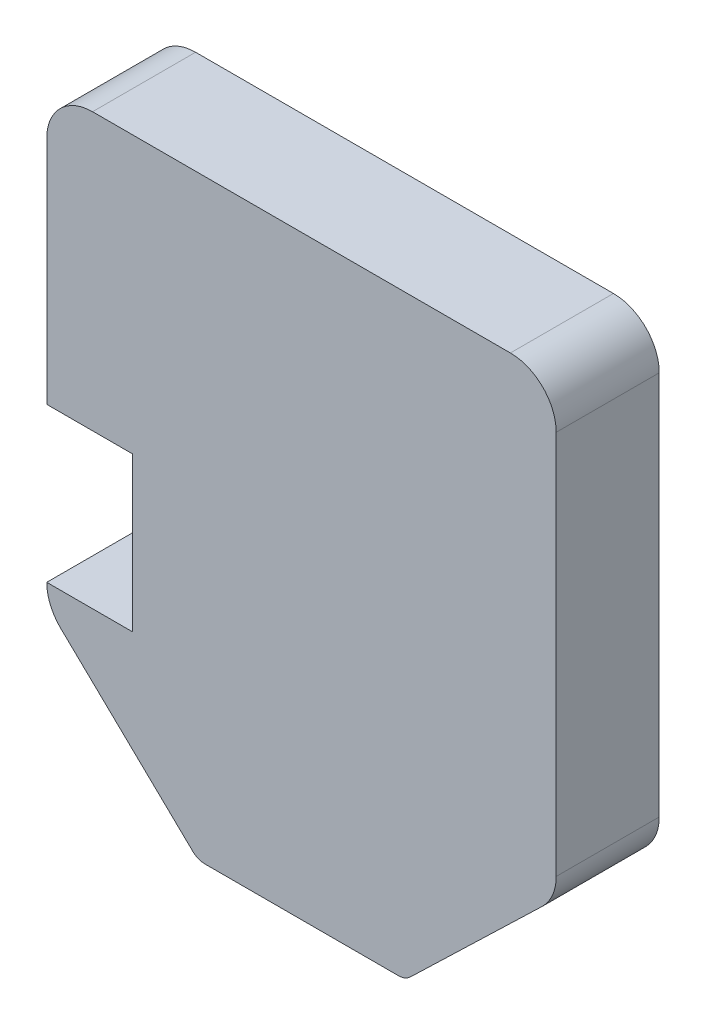
ISO-10303-21;
HEADER;
FILE_DESCRIPTION(('STEP AP214'),'2;1');
FILE_NAME('part.step','',(''),(''),'','','');
FILE_SCHEMA(('AUTOMOTIVE_DESIGN { 1 0 10303 214 1 1 1 1 }'));
ENDSEC;
DATA;
#1=APPLICATION_CONTEXT('core data for automotive mechanical design processes');
#2=APPLICATION_PROTOCOL_DEFINITION('international standard','automotive_design',2000,#1);
#3=PRODUCT_CONTEXT('',#1,'mechanical');
#4=PRODUCT('Part','Part','',(#3));
#5=PRODUCT_RELATED_PRODUCT_CATEGORY('part','',(#4));
#6=PRODUCT_DEFINITION_FORMATION('','',#4);
#7=PRODUCT_DEFINITION_CONTEXT('part definition',#1,'design');
#8=PRODUCT_DEFINITION('design','',#6,#7);
#9=PRODUCT_DEFINITION_SHAPE('','',#8);
#10=(LENGTH_UNIT() NAMED_UNIT(*) SI_UNIT(.MILLI.,.METRE.));
#11=(NAMED_UNIT(*) PLANE_ANGLE_UNIT() SI_UNIT($,.RADIAN.));
#12=(NAMED_UNIT(*) SI_UNIT($,.STERADIAN.) SOLID_ANGLE_UNIT());
#13=UNCERTAINTY_MEASURE_WITH_UNIT(LENGTH_MEASURE(1.E-05),#10,'distance_accuracy_value','');
#14=(GEOMETRIC_REPRESENTATION_CONTEXT(3) GLOBAL_UNCERTAINTY_ASSIGNED_CONTEXT((#13)) GLOBAL_UNIT_ASSIGNED_CONTEXT((#10,
#11,#12)) REPRESENTATION_CONTEXT('',''));
#15=CARTESIAN_POINT('',(0.,0.,0.));
#16=DIRECTION('',(0.,0.,1.));
#17=DIRECTION('',(1.,0.,0.));
#18=AXIS2_PLACEMENT_3D('',#15,#16,#17);
#19=CARTESIAN_POINT('',(36.5,70.602575789524,9.));
#20=DIRECTION('',(0.,0.,-1.));
#21=DIRECTION('',(-1.,0.,0.));
#22=AXIS2_PLACEMENT_3D('',#19,#20,#21);
#23=CYLINDRICAL_SURFACE('',#22,8.);
#24=CARTESIAN_POINT('',(36.5,70.602575789524,-9.));
#25=DIRECTION('',(0.,0.,-1.));
#26=DIRECTION('',(-1.,0.,0.));
#27=AXIS2_PLACEMENT_3D('',#24,#25,#26);
#28=CIRCLE('',#27,8.);
#29=CARTESIAN_POINT('',(36.5,78.602575789524,-9.));
#30=VERTEX_POINT('',#29);
#31=CARTESIAN_POINT('',(44.5,70.602575789524,-9.));
#32=VERTEX_POINT('',#31);
#33=EDGE_CURVE('E175',#30,#32,#28,.T.);
#34=ORIENTED_EDGE('',*,*,#33,.F.);
#35=DIRECTION('',(0.,0.,-1.));
#36=VECTOR('',#35,1.);
#37=CARTESIAN_POINT('',(36.5,78.602575789524,9.));
#38=LINE('',#37,#36);
#39=CARTESIAN_POINT('',(36.5,78.602575789524,9.));
#40=VERTEX_POINT('',#39);
#41=EDGE_CURVE('E11',#40,#30,#38,.T.);
#42=ORIENTED_EDGE('',*,*,#41,.F.);
#43=CARTESIAN_POINT('',(36.5,70.602575789524,9.));
#44=DIRECTION('',(0.,0.,-1.));
#45=DIRECTION('',(-1.,0.,0.));
#46=AXIS2_PLACEMENT_3D('',#43,#44,#45);
#47=CIRCLE('',#46,8.);
#48=CARTESIAN_POINT('',(44.5,70.602575789524,9.));
#49=VERTEX_POINT('',#48);
#50=EDGE_CURVE('E202',#40,#49,#47,.T.);
#51=ORIENTED_EDGE('',*,*,#50,.T.);
#52=DIRECTION('',(0.,0.,-1.));
#53=VECTOR('',#52,1.);
#54=CARTESIAN_POINT('',(44.5,70.602575789524,9.));
#55=LINE('',#54,#53);
#56=EDGE_CURVE('E43',#49,#32,#55,.T.);
#57=ORIENTED_EDGE('',*,*,#56,.T.);
#58=EDGE_LOOP('',(#34,#42,#51,#57));
#59=FACE_BOUND('',#58,.T.);
#60=ADVANCED_FACE('F37',(#59),#23,.T.);
#61=CARTESIAN_POINT('',(-36.5,78.602575789524,9.));
#62=DIRECTION('',(0.,1.,0.));
#63=DIRECTION('',(0.,0.,1.));
#64=AXIS2_PLACEMENT_3D('',#61,#62,#63);
#65=PLANE('',#64);
#66=DIRECTION('',(1.,0.,0.));
#67=VECTOR('',#66,1.);
#68=CARTESIAN_POINT('',(-36.5,78.602575789524,-9.));
#69=LINE('',#68,#67);
#70=CARTESIAN_POINT('',(-36.5,78.602575789524,-9.));
#71=VERTEX_POINT('',#70);
#72=EDGE_CURVE('E201',#71,#30,#69,.T.);
#73=ORIENTED_EDGE('',*,*,#72,.F.);
#74=DIRECTION('',(0.,0.,-1.));
#75=VECTOR('',#74,1.);
#76=CARTESIAN_POINT('',(-36.5,78.602575789524,9.));
#77=LINE('',#76,#75);
#78=CARTESIAN_POINT('',(-36.5,78.602575789524,9.));
#79=VERTEX_POINT('',#78);
#80=EDGE_CURVE('E48',#79,#71,#77,.T.);
#81=ORIENTED_EDGE('',*,*,#80,.F.);
#82=DIRECTION('',(1.,0.,0.));
#83=VECTOR('',#82,1.);
#84=CARTESIAN_POINT('',(-36.5,78.602575789524,9.));
#85=LINE('',#84,#83);
#86=EDGE_CURVE('E150',#79,#40,#85,.T.);
#87=ORIENTED_EDGE('',*,*,#86,.T.);
#88=ORIENTED_EDGE('',*,*,#41,.T.);
#89=EDGE_LOOP('',(#73,#81,#87,#88));
#90=FACE_BOUND('',#89,.T.);
#91=ADVANCED_FACE('F223',(#90),#65,.T.);
#92=CARTESIAN_POINT('',(-36.5,70.602575789524,9.));
#93=DIRECTION('',(0.,0.,-1.));
#94=DIRECTION('',(-1.,0.,0.));
#95=AXIS2_PLACEMENT_3D('',#92,#93,#94);
#96=CYLINDRICAL_SURFACE('',#95,8.);
#97=CARTESIAN_POINT('',(-36.5,70.602575789524,-9.));
#98=DIRECTION('',(0.,0.,1.));
#99=DIRECTION('',(1.,0.,0.));
#100=AXIS2_PLACEMENT_3D('',#97,#98,#99);
#101=CIRCLE('',#100,8.);
#102=CARTESIAN_POINT('',(-44.5,70.602575789524,-9.));
#103=VERTEX_POINT('',#102);
#104=EDGE_CURVE('E152',#71,#103,#101,.T.);
#105=ORIENTED_EDGE('',*,*,#104,.T.);
#106=DIRECTION('',(0.,0.,-1.));
#107=VECTOR('',#106,1.);
#108=CARTESIAN_POINT('',(-44.5,70.602575789524,9.));
#109=LINE('',#108,#107);
#110=CARTESIAN_POINT('',(-44.5,70.602575789524,9.));
#111=VERTEX_POINT('',#110);
#112=EDGE_CURVE('E151',#111,#103,#109,.T.);
#113=ORIENTED_EDGE('',*,*,#112,.F.);
#114=CARTESIAN_POINT('',(-36.5,70.602575789524,9.));
#115=DIRECTION('',(0.,0.,1.));
#116=DIRECTION('',(1.,0.,0.));
#117=AXIS2_PLACEMENT_3D('',#114,#115,#116);
#118=CIRCLE('',#117,8.);
#119=EDGE_CURVE('E139',#79,#111,#118,.T.);
#120=ORIENTED_EDGE('',*,*,#119,.F.);
#121=ORIENTED_EDGE('',*,*,#80,.T.);
#122=EDGE_LOOP('',(#105,#113,#120,#121));
#123=FACE_BOUND('',#122,.T.);
#124=ADVANCED_FACE('F155',(#123),#96,.T.);
#125=CARTESIAN_POINT('',(-44.5,70.602575789524,9.));
#126=DIRECTION('',(1.,0.,0.));
#127=DIRECTION('',(0.,1.,0.));
#128=AXIS2_PLACEMENT_3D('',#125,#126,#127);
#129=PLANE('',#128);
#130=DIRECTION('',(0.,-1.,0.));
#131=VECTOR('',#130,1.);
#132=CARTESIAN_POINT('',(-44.5,70.602575789524,-9.));
#133=LINE('',#132,#131);
#134=CARTESIAN_POINT('',(-44.5,30.323453466929,-9.));
#135=VERTEX_POINT('',#134);
#136=EDGE_CURVE('E199',#103,#135,#133,.T.);
#137=ORIENTED_EDGE('',*,*,#136,.T.);
#138=DIRECTION('',(0.,0.,-1.));
#139=VECTOR('',#138,1.);
#140=CARTESIAN_POINT('',(-44.5,30.323453466929,9.));
#141=LINE('',#140,#139);
#142=CARTESIAN_POINT('',(-44.5,30.323453466929,9.));
#143=VERTEX_POINT('',#142);
#144=EDGE_CURVE('E162',#143,#135,#141,.T.);
#145=ORIENTED_EDGE('',*,*,#144,.F.);
#146=DIRECTION('',(0.,-1.,0.));
#147=VECTOR('',#146,1.);
#148=CARTESIAN_POINT('',(-44.5,70.602575789524,9.));
#149=LINE('',#148,#147);
#150=EDGE_CURVE('E148',#111,#143,#149,.T.);
#151=ORIENTED_EDGE('',*,*,#150,.F.);
#152=ORIENTED_EDGE('',*,*,#112,.T.);
#153=EDGE_LOOP('',(#137,#145,#151,#152));
#154=FACE_BOUND('',#153,.T.);
#155=ADVANCED_FACE('F161',(#154),#129,.F.);
#156=CARTESIAN_POINT('',(-36.5,3.4047383082369,9.));
#157=DIRECTION('',(0.,0.,-1.));
#158=DIRECTION('',(-1.,0.,0.));
#159=AXIS2_PLACEMENT_3D('',#156,#157,#158);
#160=CYLINDRICAL_SURFACE('',#159,8.);
#161=CARTESIAN_POINT('',(-36.5,3.4047383082369,-9.));
#162=DIRECTION('',(0.,0.,-1.));
#163=DIRECTION('',(-1.,0.,0.));
#164=AXIS2_PLACEMENT_3D('',#161,#162,#163);
#165=CIRCLE('',#164,8.);
#166=CARTESIAN_POINT('',(-42.0463634901025,-2.36048953076983,-9.));
#167=VERTEX_POINT('',#166);
#168=CARTESIAN_POINT('',(-44.5,3.4047383082369,-9.));
#169=VERTEX_POINT('',#168);
#170=EDGE_CURVE('E197',#167,#169,#165,.T.);
#171=ORIENTED_EDGE('',*,*,#170,.F.);
#172=DIRECTION('',(0.,0.,-1.));
#173=VECTOR('',#172,1.);
#174=CARTESIAN_POINT('',(-42.0463634901025,-2.36048953076983,9.));
#175=LINE('',#174,#173);
#176=CARTESIAN_POINT('',(-42.0463634901025,-2.36048953076983,9.));
#177=VERTEX_POINT('',#176);
#178=EDGE_CURVE('E158',#177,#167,#175,.T.);
#179=ORIENTED_EDGE('',*,*,#178,.F.);
#180=CARTESIAN_POINT('',(-36.5,3.4047383082369,9.));
#181=DIRECTION('',(0.,0.,-1.));
#182=DIRECTION('',(-1.,0.,0.));
#183=AXIS2_PLACEMENT_3D('',#180,#181,#182);
#184=CIRCLE('',#183,8.);
#185=CARTESIAN_POINT('',(-44.5,3.4047383082369,9.));
#186=VERTEX_POINT('',#185);
#187=EDGE_CURVE('E163',#177,#186,#184,.T.);
#188=ORIENTED_EDGE('',*,*,#187,.T.);
#189=DIRECTION('',(0.,0.,1.));
#190=VECTOR('',#189,1.);
#191=CARTESIAN_POINT('',(-44.5,3.4047383082369,-9.));
#192=LINE('',#191,#190);
#193=EDGE_CURVE('E338',#169,#186,#192,.T.);
#194=ORIENTED_EDGE('',*,*,#193,.F.);
#195=EDGE_LOOP('',(#171,#179,#188,#194));
#196=FACE_BOUND('',#195,.T.);
#197=ADVANCED_FACE('F236',(#196),#160,.T.);
#198=CARTESIAN_POINT('',(-42.0463634901025,-2.36048953076983,9.));
#199=DIRECTION('',(0.693295436262811,0.72065347987584,0.));
#200=DIRECTION('',(-0.72065347987584,0.693295436262811,0.));
#201=AXIS2_PLACEMENT_3D('',#198,#199,#200);
#202=PLANE('',#201);
#203=DIRECTION('',(0.72065347987584,-0.693295436262811,0.));
#204=VECTOR('',#203,1.);
#205=CARTESIAN_POINT('',(-42.0463634901025,-2.36048953076983,-9.));
#206=LINE('',#205,#204);
#207=CARTESIAN_POINT('',(-18.9714805752778,-24.5593846501035,-9.));
#208=VERTEX_POINT('',#207);
#209=EDGE_CURVE('E192',#167,#208,#206,.T.);
#210=ORIENTED_EDGE('',*,*,#209,.T.);
#211=DIRECTION('',(0.,0.,-1.));
#212=VECTOR('',#211,1.);
#213=CARTESIAN_POINT('',(-18.9714805752778,-24.5593846501035,9.));
#214=LINE('',#213,#212);
#215=CARTESIAN_POINT('',(-18.9714805752778,-24.5593846501035,9.));
#216=VERTEX_POINT('',#215);
#217=EDGE_CURVE('E207',#216,#208,#214,.T.);
#218=ORIENTED_EDGE('',*,*,#217,.F.);
#219=DIRECTION('',(0.72065347987584,-0.693295436262811,0.));
#220=VECTOR('',#219,1.);
#221=CARTESIAN_POINT('',(-42.0463634901025,-2.36048953076983,9.));
#222=LINE('',#221,#220);
#223=EDGE_CURVE('E170',#177,#216,#222,.T.);
#224=ORIENTED_EDGE('',*,*,#223,.F.);
#225=ORIENTED_EDGE('',*,*,#178,.T.);
#226=EDGE_LOOP('',(#210,#218,#224,#225));
#227=FACE_BOUND('',#226,.T.);
#228=ADVANCED_FACE('F241',(#227),#202,.F.);
#229=CARTESIAN_POINT('',(-16.8915942664894,-22.397424210476,9.));
#230=DIRECTION('',(0.,0.,-1.));
#231=DIRECTION('',(-1.,0.,0.));
#232=AXIS2_PLACEMENT_3D('',#229,#230,#231);
#233=CYLINDRICAL_SURFACE('',#232,3.);
#234=CARTESIAN_POINT('',(-16.8915942664894,-22.397424210476,-9.));
#235=DIRECTION('',(0.,0.,-1.));
#236=DIRECTION('',(-1.,0.,0.));
#237=AXIS2_PLACEMENT_3D('',#234,#235,#236);
#238=CIRCLE('',#237,3.);
#239=CARTESIAN_POINT('',(-16.8915942664894,-25.397424210476,-9.));
#240=VERTEX_POINT('',#239);
#241=EDGE_CURVE('E191',#240,#208,#238,.T.);
#242=ORIENTED_EDGE('',*,*,#241,.F.);
#243=DIRECTION('',(0.,0.,-1.));
#244=VECTOR('',#243,1.);
#245=CARTESIAN_POINT('',(-16.8915942664894,-25.397424210476,9.));
#246=LINE('',#245,#244);
#247=CARTESIAN_POINT('',(-16.8915942664894,-25.397424210476,9.));
#248=VERTEX_POINT('',#247);
#249=EDGE_CURVE('E211',#248,#240,#246,.T.);
#250=ORIENTED_EDGE('',*,*,#249,.F.);
#251=CARTESIAN_POINT('',(-16.8915942664894,-22.397424210476,9.));
#252=DIRECTION('',(0.,0.,-1.));
#253=DIRECTION('',(-1.,0.,0.));
#254=AXIS2_PLACEMENT_3D('',#251,#252,#253);
#255=CIRCLE('',#254,3.);
#256=EDGE_CURVE('E322',#248,#216,#255,.T.);
#257=ORIENTED_EDGE('',*,*,#256,.T.);
#258=ORIENTED_EDGE('',*,*,#217,.T.);
#259=EDGE_LOOP('',(#242,#250,#257,#258));
#260=FACE_BOUND('',#259,.T.);
#261=ADVANCED_FACE('F244',(#260),#233,.T.);
#262=CARTESIAN_POINT('',(-16.8915942664894,-25.397424210476,9.));
#263=DIRECTION('',(0.,1.,0.));
#264=DIRECTION('',(-1.,0.,0.));
#265=AXIS2_PLACEMENT_3D('',#262,#263,#264);
#266=PLANE('',#265);
#267=DIRECTION('',(1.,0.,0.));
#268=VECTOR('',#267,1.);
#269=CARTESIAN_POINT('',(-16.8915942664894,-25.397424210476,-9.));
#270=LINE('',#269,#268);
#271=CARTESIAN_POINT('',(16.9237467669128,-25.397424210476,-9.));
#272=VERTEX_POINT('',#271);
#273=EDGE_CURVE('E187',#240,#272,#270,.T.);
#274=ORIENTED_EDGE('',*,*,#273,.T.);
#275=DIRECTION('',(0.,0.,-1.));
#276=VECTOR('',#275,1.);
#277=CARTESIAN_POINT('',(16.9237467669128,-25.397424210476,9.));
#278=LINE('',#277,#276);
#279=CARTESIAN_POINT('',(16.9237467669128,-25.397424210476,9.));
#280=VERTEX_POINT('',#279);
#281=EDGE_CURVE('E213',#280,#272,#278,.T.);
#282=ORIENTED_EDGE('',*,*,#281,.F.);
#283=DIRECTION('',(1.,0.,0.));
#284=VECTOR('',#283,1.);
#285=CARTESIAN_POINT('',(-16.8915942664894,-25.397424210476,9.));
#286=LINE('',#285,#284);
#287=EDGE_CURVE('E325',#248,#280,#286,.T.);
#288=ORIENTED_EDGE('',*,*,#287,.F.);
#289=ORIENTED_EDGE('',*,*,#249,.T.);
#290=EDGE_LOOP('',(#274,#282,#288,#289));
#291=FACE_BOUND('',#290,.T.);
#292=ADVANCED_FACE('F247',(#291),#266,.F.);
#293=CARTESIAN_POINT('',(16.9237467669128,-22.397424210476,9.));
#294=DIRECTION('',(0.,0.,-1.));
#295=DIRECTION('',(-1.,0.,0.));
#296=AXIS2_PLACEMENT_3D('',#293,#294,#295);
#297=CYLINDRICAL_SURFACE('',#296,3.);
#298=CARTESIAN_POINT('',(16.9237467669128,-22.397424210476,-9.));
#299=DIRECTION('',(0.,0.,-1.));
#300=DIRECTION('',(-1.,0.,0.));
#301=AXIS2_PLACEMENT_3D('',#298,#299,#300);
#302=CIRCLE('',#301,3.);
#303=CARTESIAN_POINT('',(19.0049940370671,-24.5580745293557,-9.));
#304=VERTEX_POINT('',#303);
#305=EDGE_CURVE('E183',#304,#272,#302,.T.);
#306=ORIENTED_EDGE('',*,*,#305,.F.);
#307=DIRECTION('',(0.,0.,-1.));
#308=VECTOR('',#307,1.);
#309=CARTESIAN_POINT('',(19.0049940370671,-24.5580745293557,9.));
#310=LINE('',#309,#308);
#311=CARTESIAN_POINT('',(19.0049940370671,-24.5580745293557,9.));
#312=VERTEX_POINT('',#311);
#313=EDGE_CURVE('E214',#312,#304,#310,.T.);
#314=ORIENTED_EDGE('',*,*,#313,.F.);
#315=CARTESIAN_POINT('',(16.9237467669128,-22.397424210476,9.));
#316=DIRECTION('',(0.,0.,-1.));
#317=DIRECTION('',(-1.,0.,0.));
#318=AXIS2_PLACEMENT_3D('',#315,#316,#317);
#319=CIRCLE('',#318,3.);
#320=EDGE_CURVE('E317',#312,#280,#319,.T.);
#321=ORIENTED_EDGE('',*,*,#320,.T.);
#322=ORIENTED_EDGE('',*,*,#281,.T.);
#323=EDGE_LOOP('',(#306,#314,#321,#322));
#324=FACE_BOUND('',#323,.T.);
#325=ADVANCED_FACE('F251',(#324),#297,.T.);
#326=CARTESIAN_POINT('',(42.0499927204117,-2.35997047645608,9.));
#327=DIRECTION('',(0.693749090051461,-0.720216772959898,0.));
#328=DIRECTION('',(0.720216772959898,0.693749090051461,0.));
#329=AXIS2_PLACEMENT_3D('',#326,#327,#328);
#330=PLANE('',#329);
#331=DIRECTION('',(-0.720216772959898,-0.693749090051461,0.));
#332=VECTOR('',#331,1.);
#333=CARTESIAN_POINT('',(42.0499927204117,-2.35997047645608,-9.));
#334=LINE('',#333,#332);
#335=CARTESIAN_POINT('',(42.0499927204117,-2.35997047645608,-9.));
#336=VERTEX_POINT('',#335);
#337=EDGE_CURVE('E185',#336,#304,#334,.T.);
#338=ORIENTED_EDGE('',*,*,#337,.F.);
#339=DIRECTION('',(0.,0.,-1.));
#340=VECTOR('',#339,1.);
#341=CARTESIAN_POINT('',(42.0499927204117,-2.35997047645608,9.));
#342=LINE('',#341,#340);
#343=CARTESIAN_POINT('',(42.0499927204117,-2.35997047645608,9.));
#344=VERTEX_POINT('',#343);
#345=EDGE_CURVE('E220',#344,#336,#342,.T.);
#346=ORIENTED_EDGE('',*,*,#345,.F.);
#347=DIRECTION('',(-0.720216772959898,-0.693749090051461,0.));
#348=VECTOR('',#347,1.);
#349=CARTESIAN_POINT('',(42.0499927204117,-2.35997047645608,9.));
#350=LINE('',#349,#348);
#351=EDGE_CURVE('E316',#344,#312,#350,.T.);
#352=ORIENTED_EDGE('',*,*,#351,.T.);
#353=ORIENTED_EDGE('',*,*,#313,.T.);
#354=EDGE_LOOP('',(#338,#346,#352,#353));
#355=FACE_BOUND('',#354,.T.);
#356=ADVANCED_FACE('F260',(#355),#330,.T.);
#357=CARTESIAN_POINT('',(36.5,3.40176370722312,9.));
#358=DIRECTION('',(0.,0.,-1.));
#359=DIRECTION('',(-1.,0.,0.));
#360=AXIS2_PLACEMENT_3D('',#357,#358,#359);
#361=CYLINDRICAL_SURFACE('',#360,8.);
#362=CARTESIAN_POINT('',(36.5,3.40176370722312,-9.));
#363=DIRECTION('',(0.,0.,1.));
#364=DIRECTION('',(1.,0.,0.));
#365=AXIS2_PLACEMENT_3D('',#362,#363,#364);
#366=CIRCLE('',#365,8.);
#367=CARTESIAN_POINT('',(44.5,3.40176370722312,-9.));
#368=VERTEX_POINT('',#367);
#369=EDGE_CURVE('E177',#336,#368,#366,.T.);
#370=ORIENTED_EDGE('',*,*,#369,.T.);
#371=DIRECTION('',(0.,0.,-1.));
#372=VECTOR('',#371,1.);
#373=CARTESIAN_POINT('',(44.5,3.40176370722312,9.));
#374=LINE('',#373,#372);
#375=CARTESIAN_POINT('',(44.5,3.40176370722312,9.));
#376=VERTEX_POINT('',#375);
#377=EDGE_CURVE('E217',#376,#368,#374,.T.);
#378=ORIENTED_EDGE('',*,*,#377,.F.);
#379=CARTESIAN_POINT('',(36.5,3.40176370722312,9.));
#380=DIRECTION('',(0.,0.,1.));
#381=DIRECTION('',(1.,0.,0.));
#382=AXIS2_PLACEMENT_3D('',#379,#380,#381);
#383=CIRCLE('',#382,8.);
#384=EDGE_CURVE('E314',#344,#376,#383,.T.);
#385=ORIENTED_EDGE('',*,*,#384,.F.);
#386=ORIENTED_EDGE('',*,*,#345,.T.);
#387=EDGE_LOOP('',(#370,#378,#385,#386));
#388=FACE_BOUND('',#387,.T.);
#389=ADVANCED_FACE('F261',(#388),#361,.T.);
#390=CARTESIAN_POINT('',(44.5,70.602575789524,9.));
#391=DIRECTION('',(1.,0.,0.));
#392=DIRECTION('',(0.,1.,0.));
#393=AXIS2_PLACEMENT_3D('',#390,#391,#392);
#394=PLANE('',#393);
#395=DIRECTION('',(0.,-1.,0.));
#396=VECTOR('',#395,1.);
#397=CARTESIAN_POINT('',(44.5,70.602575789524,-9.));
#398=LINE('',#397,#396);
#399=EDGE_CURVE('E174',#32,#368,#398,.T.);
#400=ORIENTED_EDGE('',*,*,#399,.F.);
#401=ORIENTED_EDGE('',*,*,#56,.F.);
#402=DIRECTION('',(0.,-1.,0.));
#403=VECTOR('',#402,1.);
#404=CARTESIAN_POINT('',(44.5,70.602575789524,9.));
#405=LINE('',#404,#403);
#406=EDGE_CURVE('E315',#49,#376,#405,.T.);
#407=ORIENTED_EDGE('',*,*,#406,.T.);
#408=ORIENTED_EDGE('',*,*,#377,.T.);
#409=EDGE_LOOP('',(#400,#401,#407,#408));
#410=FACE_BOUND('',#409,.T.);
#411=ADVANCED_FACE('F219',(#410),#394,.T.);
#412=CARTESIAN_POINT('',(36.5,70.602575789524,9.));
#413=DIRECTION('',(0.,0.,-1.));
#414=DIRECTION('',(-1.,0.,0.));
#415=AXIS2_PLACEMENT_3D('',#412,#413,#414);
#416=PLANE('',#415);
#417=ORIENTED_EDGE('',*,*,#150,.T.);
#418=DIRECTION('',(-1.,0.,0.));
#419=VECTOR('',#418,1.);
#420=CARTESIAN_POINT('',(-29.5,30.323453466929,9.));
#421=LINE('',#420,#419);
#422=CARTESIAN_POINT('',(-29.5,30.323453466929,9.));
#423=VERTEX_POINT('',#422);
#424=EDGE_CURVE('E304',#423,#143,#421,.T.);
#425=ORIENTED_EDGE('',*,*,#424,.F.);
#426=DIRECTION('',(0.,1.,0.));
#427=VECTOR('',#426,1.);
#428=CARTESIAN_POINT('',(-29.5,3.4047383082369,9.));
#429=LINE('',#428,#427);
#430=CARTESIAN_POINT('',(-29.5,3.4047383082369,9.));
#431=VERTEX_POINT('',#430);
#432=EDGE_CURVE('E307',#431,#423,#429,.T.);
#433=ORIENTED_EDGE('',*,*,#432,.F.);
#434=DIRECTION('',(-1.,0.,0.));
#435=VECTOR('',#434,1.);
#436=CARTESIAN_POINT('',(-29.5,3.4047383082369,9.));
#437=LINE('',#436,#435);
#438=EDGE_CURVE('E305',#431,#186,#437,.T.);
#439=ORIENTED_EDGE('',*,*,#438,.T.);
#440=ORIENTED_EDGE('',*,*,#187,.F.);
#441=ORIENTED_EDGE('',*,*,#223,.T.);
#442=ORIENTED_EDGE('',*,*,#256,.F.);
#443=ORIENTED_EDGE('',*,*,#287,.T.);
#444=ORIENTED_EDGE('',*,*,#320,.F.);
#445=ORIENTED_EDGE('',*,*,#351,.F.);
#446=ORIENTED_EDGE('',*,*,#384,.T.);
#447=ORIENTED_EDGE('',*,*,#406,.F.);
#448=ORIENTED_EDGE('',*,*,#50,.F.);
#449=ORIENTED_EDGE('',*,*,#86,.F.);
#450=ORIENTED_EDGE('',*,*,#119,.T.);
#451=EDGE_LOOP('',(#417,#425,#433,#439,#440,#441,#442,#443,#444,#445,#446,#447,#448,#449,#450));
#452=FACE_BOUND('',#451,.T.);
#453=ADVANCED_FACE('F142',(#452),#416,.F.);
#454=CARTESIAN_POINT('',(36.5,70.602575789524,-9.));
#455=DIRECTION('',(0.,0.,-1.));
#456=DIRECTION('',(-1.,0.,0.));
#457=AXIS2_PLACEMENT_3D('',#454,#455,#456);
#458=PLANE('',#457);
#459=DIRECTION('',(-1.,0.,0.));
#460=VECTOR('',#459,1.);
#461=CARTESIAN_POINT('',(-29.5,30.323453466929,-9.));
#462=LINE('',#461,#460);
#463=CARTESIAN_POINT('',(-29.5,30.323453466929,-9.));
#464=VERTEX_POINT('',#463);
#465=EDGE_CURVE('E176',#464,#135,#462,.T.);
#466=ORIENTED_EDGE('',*,*,#465,.T.);
#467=ORIENTED_EDGE('',*,*,#136,.F.);
#468=ORIENTED_EDGE('',*,*,#104,.F.);
#469=ORIENTED_EDGE('',*,*,#72,.T.);
#470=ORIENTED_EDGE('',*,*,#33,.T.);
#471=ORIENTED_EDGE('',*,*,#399,.T.);
#472=ORIENTED_EDGE('',*,*,#369,.F.);
#473=ORIENTED_EDGE('',*,*,#337,.T.);
#474=ORIENTED_EDGE('',*,*,#305,.T.);
#475=ORIENTED_EDGE('',*,*,#273,.F.);
#476=ORIENTED_EDGE('',*,*,#241,.T.);
#477=ORIENTED_EDGE('',*,*,#209,.F.);
#478=ORIENTED_EDGE('',*,*,#170,.T.);
#479=DIRECTION('',(-1.,0.,0.));
#480=VECTOR('',#479,1.);
#481=CARTESIAN_POINT('',(-29.5,3.4047383082369,-9.));
#482=LINE('',#481,#480);
#483=CARTESIAN_POINT('',(-29.5,3.4047383082369,-9.));
#484=VERTEX_POINT('',#483);
#485=EDGE_CURVE('E296',#484,#169,#482,.T.);
#486=ORIENTED_EDGE('',*,*,#485,.F.);
#487=DIRECTION('',(0.,-1.,0.));
#488=VECTOR('',#487,1.);
#489=CARTESIAN_POINT('',(-29.5,30.323453466929,-9.));
#490=LINE('',#489,#488);
#491=EDGE_CURVE('E290',#464,#484,#490,.T.);
#492=ORIENTED_EDGE('',*,*,#491,.F.);
#493=EDGE_LOOP('',(#466,#467,#468,#469,#470,#471,#472,#473,#474,#475,#476,#477,#478,#486,#492));
#494=FACE_BOUND('',#493,.T.);
#495=ADVANCED_FACE('F221',(#494),#458,.T.);
#496=CARTESIAN_POINT('',(-29.5,30.323453466929,9.));
#497=DIRECTION('',(0.,1.,0.));
#498=DIRECTION('',(-1.,0.,0.));
#499=AXIS2_PLACEMENT_3D('',#496,#497,#498);
#500=PLANE('',#499);
#501=ORIENTED_EDGE('',*,*,#144,.T.);
#502=ORIENTED_EDGE('',*,*,#465,.F.);
#503=DIRECTION('',(0.,0.,-1.));
#504=VECTOR('',#503,1.);
#505=CARTESIAN_POINT('',(-29.5,30.323453466929,9.));
#506=LINE('',#505,#504);
#507=EDGE_CURVE('E57',#423,#464,#506,.T.);
#508=ORIENTED_EDGE('',*,*,#507,.F.);
#509=ORIENTED_EDGE('',*,*,#424,.T.);
#510=EDGE_LOOP('',(#501,#502,#508,#509));
#511=FACE_BOUND('',#510,.T.);
#512=ADVANCED_FACE('F275',(#511),#500,.F.);
#513=CARTESIAN_POINT('',(-29.5,3.4047383082369,-9.));
#514=DIRECTION('',(0.,-1.,0.));
#515=DIRECTION('',(1.,0.,0.));
#516=AXIS2_PLACEMENT_3D('',#513,#514,#515);
#517=PLANE('',#516);
#518=ORIENTED_EDGE('',*,*,#193,.T.);
#519=ORIENTED_EDGE('',*,*,#438,.F.);
#520=DIRECTION('',(0.,0.,1.));
#521=VECTOR('',#520,1.);
#522=CARTESIAN_POINT('',(-29.5,3.4047383082369,-9.));
#523=LINE('',#522,#521);
#524=EDGE_CURVE('E292',#484,#431,#523,.T.);
#525=ORIENTED_EDGE('',*,*,#524,.F.);
#526=ORIENTED_EDGE('',*,*,#485,.T.);
#527=EDGE_LOOP('',(#518,#519,#525,#526));
#528=FACE_BOUND('',#527,.T.);
#529=ADVANCED_FACE('F273',(#528),#517,.F.);
#530=CARTESIAN_POINT('',(-29.5,0.,0.));
#531=DIRECTION('',(-1.,0.,0.));
#532=DIRECTION('',(0.,0.,1.));
#533=AXIS2_PLACEMENT_3D('',#530,#531,#532);
#534=PLANE('',#533);
#535=ORIENTED_EDGE('',*,*,#491,.T.);
#536=ORIENTED_EDGE('',*,*,#524,.T.);
#537=ORIENTED_EDGE('',*,*,#432,.T.);
#538=ORIENTED_EDGE('',*,*,#507,.T.);
#539=EDGE_LOOP('',(#535,#536,#537,#538));
#540=FACE_BOUND('',#539,.T.);
#541=ADVANCED_FACE('F280',(#540),#534,.T.);
#542=CLOSED_SHELL('',(#60,#91,#124,#155,#197,#228,#261,#292,#325,#356,#389,#411,#453,#495,#512,
#529,#541));
#543=MANIFOLD_SOLID_BREP('B2',#542);
#544=ADVANCED_BREP_SHAPE_REPRESENTATION('',(#18,#543),#14);
#545=SHAPE_DEFINITION_REPRESENTATION(#9,#544);
ENDSEC;
END-ISO-10303-21;
